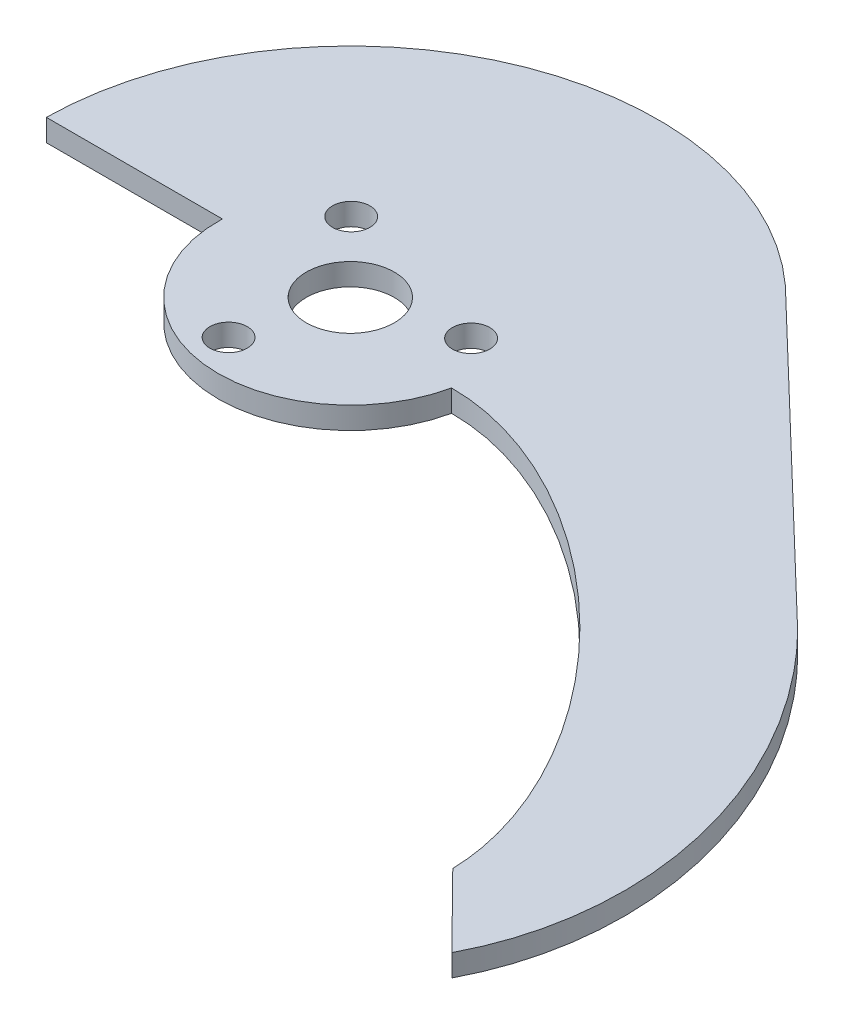
ISO-10303-21;
HEADER;
FILE_DESCRIPTION(('STEP AP214'),'2;1');
FILE_NAME('part.step','',(''),(''),'','','');
FILE_SCHEMA(('AUTOMOTIVE_DESIGN { 1 0 10303 214 1 1 1 1 }'));
ENDSEC;
DATA;
#1=APPLICATION_CONTEXT('core data for automotive mechanical design processes');
#2=APPLICATION_PROTOCOL_DEFINITION('international standard','automotive_design',2000,#1);
#3=PRODUCT_CONTEXT('',#1,'mechanical');
#4=PRODUCT('Part','Part','',(#3));
#5=PRODUCT_RELATED_PRODUCT_CATEGORY('part','',(#4));
#6=PRODUCT_DEFINITION_FORMATION('','',#4);
#7=PRODUCT_DEFINITION_CONTEXT('part definition',#1,'design');
#8=PRODUCT_DEFINITION('design','',#6,#7);
#9=PRODUCT_DEFINITION_SHAPE('','',#8);
#10=(LENGTH_UNIT() NAMED_UNIT(*) SI_UNIT(.MILLI.,.METRE.));
#11=(NAMED_UNIT(*) PLANE_ANGLE_UNIT() SI_UNIT($,.RADIAN.));
#12=(NAMED_UNIT(*) SI_UNIT($,.STERADIAN.) SOLID_ANGLE_UNIT());
#13=UNCERTAINTY_MEASURE_WITH_UNIT(LENGTH_MEASURE(1.E-05),#10,'distance_accuracy_value','');
#14=(GEOMETRIC_REPRESENTATION_CONTEXT(3) GLOBAL_UNCERTAINTY_ASSIGNED_CONTEXT((#13)) GLOBAL_UNIT_ASSIGNED_CONTEXT((#10,
#11,#12)) REPRESENTATION_CONTEXT('',''));
#15=CARTESIAN_POINT('',(0.,0.,0.));
#16=DIRECTION('',(0.,0.,1.));
#17=DIRECTION('',(1.,0.,0.));
#18=AXIS2_PLACEMENT_3D('',#15,#16,#17);
#19=CARTESIAN_POINT('',(25.9929288739405,2.,26.3318751431467));
#20=DIRECTION('',(0.,-1.,0.));
#21=DIRECTION('',(0.,0.,-1.));
#22=AXIS2_PLACEMENT_3D('',#19,#20,#21);
#23=PLANE('',#22);
#24=CARTESIAN_POINT('',(25.9929288739405,2.,26.3318751431467));
#25=DIRECTION('',(0.,1.,0.));
#26=DIRECTION('',(-0.702511591187583,0.,-0.711672301166127));
#27=AXIS2_PLACEMENT_3D('',#24,#25,#26);
#28=ELLIPSE('',#27,37.,29.);
#29=CARTESIAN_POINT('',(56.1989749616137,2.,46.9675578994099));
#30=VERTEX_POINT('',#29);
#31=CARTESIAN_POINT('',(46.6314256077582,2.,5.95903899870688));
#32=VERTEX_POINT('',#31);
#33=EDGE_CURVE('E204',#30,#32,#28,.T.);
#34=ORIENTED_EDGE('',*,*,#33,.T.);
#35=DIRECTION('',(-0.721486768193004,0.,-0.692428222505708));
#36=VECTOR('',#35,1.);
#37=CARTESIAN_POINT('',(46.6314256077582,2.,5.95903899870688));
#38=LINE('',#37,#36);
#39=CARTESIAN_POINT('',(18.8288086844172,2.,-20.723801859833));
#40=VERTEX_POINT('',#39);
#41=EDGE_CURVE('E93',#32,#40,#38,.T.);
#42=ORIENTED_EDGE('',*,*,#41,.T.);
#43=CARTESIAN_POINT('',(0.,2.,0.));
#44=DIRECTION('',(0.,1.,0.));
#45=DIRECTION('',(0.,0.,-1.));
#46=AXIS2_PLACEMENT_3D('',#43,#44,#45);
#47=CIRCLE('',#46,28.);
#48=CARTESIAN_POINT('',(-27.9976502789953,2.,-0.362737997837238));
#49=VERTEX_POINT('',#48);
#50=EDGE_CURVE('E208',#40,#49,#47,.T.);
#51=ORIENTED_EDGE('',*,*,#50,.T.);
#52=DIRECTION('',(1.,0.,0.));
#53=VECTOR('',#52,1.);
#54=CARTESIAN_POINT('',(-11.9945162947459,2.,-0.362737997837457));
#55=LINE('',#54,#53);
#56=CARTESIAN_POINT('',(-11.9945162947496,2.,-0.362737997837571));
#57=VERTEX_POINT('',#56);
#58=EDGE_CURVE('E109',#49,#57,#55,.T.);
#59=ORIENTED_EDGE('',*,*,#58,.T.);
#60=CARTESIAN_POINT('',(0.,2.,0.));
#61=DIRECTION('',(0.,1.,0.));
#62=DIRECTION('',(0.,0.,1.));
#63=AXIS2_PLACEMENT_3D('',#60,#61,#62);
#64=CIRCLE('',#63,12.0000000000037);
#65=CARTESIAN_POINT('',(11.7317613570304,2.,2.52304884254457));
#66=VERTEX_POINT('',#65);
#67=EDGE_CURVE('E103',#57,#66,#64,.T.);
#68=ORIENTED_EDGE('',*,*,#67,.T.);
#69=CARTESIAN_POINT('',(25.9929288739405,2.,26.3318751431467));
#70=DIRECTION('',(0.,-1.,0.));
#71=DIRECTION('',(0.702511591187581,0.,0.711672301166128));
#72=AXIS2_PLACEMENT_3D('',#69,#70,#71);
#73=ELLIPSE('',#72,30.,15.);
#74=CARTESIAN_POINT('',(49.6143738528614,2.,40.2970939780885));
#75=VERTEX_POINT('',#74);
#76=EDGE_CURVE('E107',#66,#75,#73,.T.);
#77=ORIENTED_EDGE('',*,*,#76,.T.);
#78=DIRECTION('',(0.70251159118758,0.,0.711672301166129));
#79=VECTOR('',#78,1.);
#80=CARTESIAN_POINT('',(49.6143738528614,2.,40.2970939780885));
#81=LINE('',#80,#79);
#82=EDGE_CURVE('E53',#75,#30,#81,.T.);
#83=ORIENTED_EDGE('',*,*,#82,.T.);
#84=EDGE_LOOP('',(#34,#42,#51,#59,#68,#77,#83));
#85=FACE_BOUND('',#84,.T.);
#86=CARTESIAN_POINT('',(0.,2.,0.));
#87=DIRECTION('',(0.,1.,0.));
#88=DIRECTION('',(0.,0.,1.));
#89=AXIS2_PLACEMENT_3D('',#86,#87,#88);
#90=CIRCLE('',#89,4.);
#91=CARTESIAN_POINT('',(0.,2.,4.));
#92=VERTEX_POINT('',#91);
#93=EDGE_CURVE('E199',#92,#92,#90,.T.);
#94=ORIENTED_EDGE('',*,*,#93,.F.);
#95=EDGE_LOOP('',(#94));
#96=FACE_BOUND('',#95,.T.);
#97=CARTESIAN_POINT('',(-6.32260432068822,2.,-6.40505071049517));
#98=DIRECTION('',(0.,1.,0.));
#99=DIRECTION('',(0.,0.,1.));
#100=AXIS2_PLACEMENT_3D('',#97,#98,#99);
#101=CIRCLE('',#100,1.7);
#102=CARTESIAN_POINT('',(-6.32260432068822,2.,-4.70505071049517));
#103=VERTEX_POINT('',#102);
#104=EDGE_CURVE('E193',#103,#103,#101,.T.);
#105=ORIENTED_EDGE('',*,*,#104,.F.);
#106=EDGE_LOOP('',(#105));
#107=FACE_BOUND('',#106,.T.);
#108=CARTESIAN_POINT('',(8.70823878816048,2.,-2.27301060454571));
#109=DIRECTION('',(0.,1.,0.));
#110=DIRECTION('',(0.,0.,1.));
#111=AXIS2_PLACEMENT_3D('',#108,#109,#110);
#112=CIRCLE('',#111,1.7);
#113=CARTESIAN_POINT('',(8.70823878816048,2.,-0.573010604545707));
#114=VERTEX_POINT('',#113);
#115=EDGE_CURVE('E187',#114,#114,#112,.T.);
#116=ORIENTED_EDGE('',*,*,#115,.F.);
#117=EDGE_LOOP('',(#116));
#118=FACE_BOUND('',#117,.T.);
#119=CARTESIAN_POINT('',(-2.38563446747228,2.,8.67806131504083));
#120=DIRECTION('',(0.,1.,0.));
#121=DIRECTION('',(0.,0.,1.));
#122=AXIS2_PLACEMENT_3D('',#119,#120,#121);
#123=CIRCLE('',#122,1.7);
#124=CARTESIAN_POINT('',(-2.38563446747228,2.,10.3780613150408));
#125=VERTEX_POINT('',#124);
#126=EDGE_CURVE('E178',#125,#125,#123,.T.);
#127=ORIENTED_EDGE('',*,*,#126,.F.);
#128=EDGE_LOOP('',(#127));
#129=FACE_BOUND('',#128,.T.);
#130=ADVANCED_FACE('F35',(#85,#96,#107,#118,#129),#23,.F.);
#131=CARTESIAN_POINT('',(25.9929288739405,0.,26.3318751431467));
#132=DIRECTION('',(0.,-1.,0.));
#133=DIRECTION('',(0.,0.,-1.));
#134=AXIS2_PLACEMENT_3D('',#131,#132,#133);
#135=PLANE('',#134);
#136=CARTESIAN_POINT('',(8.70823878816048,0.,-2.27301060454571));
#137=DIRECTION('',(0.,1.,0.));
#138=DIRECTION('',(0.,0.,1.));
#139=AXIS2_PLACEMENT_3D('',#136,#137,#138);
#140=CIRCLE('',#139,1.7);
#141=CARTESIAN_POINT('',(8.70823878816048,0.,-0.573010604545707));
#142=VERTEX_POINT('',#141);
#143=EDGE_CURVE('E184',#142,#142,#140,.T.);
#144=ORIENTED_EDGE('',*,*,#143,.T.);
#145=EDGE_LOOP('',(#144));
#146=FACE_BOUND('',#145,.T.);
#147=CARTESIAN_POINT('',(0.,0.,0.));
#148=DIRECTION('',(0.,1.,0.));
#149=DIRECTION('',(0.,0.,1.));
#150=AXIS2_PLACEMENT_3D('',#147,#148,#149);
#151=CIRCLE('',#150,4.);
#152=CARTESIAN_POINT('',(0.,0.,4.));
#153=VERTEX_POINT('',#152);
#154=EDGE_CURVE('E196',#153,#153,#151,.T.);
#155=ORIENTED_EDGE('',*,*,#154,.T.);
#156=EDGE_LOOP('',(#155));
#157=FACE_BOUND('',#156,.T.);
#158=CARTESIAN_POINT('',(25.9929288739405,0.,26.3318751431467));
#159=DIRECTION('',(0.,1.,0.));
#160=DIRECTION('',(-0.702511591187583,0.,-0.711672301166127));
#161=AXIS2_PLACEMENT_3D('',#158,#159,#160);
#162=ELLIPSE('',#161,37.,29.);
#163=CARTESIAN_POINT('',(56.1989749616137,0.,46.9675578994099));
#164=VERTEX_POINT('',#163);
#165=CARTESIAN_POINT('',(46.6314256077582,0.,5.95903899870688));
#166=VERTEX_POINT('',#165);
#167=EDGE_CURVE('E202',#164,#166,#162,.T.);
#168=ORIENTED_EDGE('',*,*,#167,.F.);
#169=DIRECTION('',(0.70251159118758,0.,0.711672301166129));
#170=VECTOR('',#169,1.);
#171=CARTESIAN_POINT('',(49.6143738528614,0.,40.2970939780885));
#172=LINE('',#171,#170);
#173=CARTESIAN_POINT('',(49.6143738528614,0.,40.2970939780885));
#174=VERTEX_POINT('',#173);
#175=EDGE_CURVE('E85',#174,#164,#172,.T.);
#176=ORIENTED_EDGE('',*,*,#175,.F.);
#177=CARTESIAN_POINT('',(25.9929288739405,0.,26.3318751431467));
#178=DIRECTION('',(0.,-1.,0.));
#179=DIRECTION('',(0.702511591187581,0.,0.711672301166128));
#180=AXIS2_PLACEMENT_3D('',#177,#178,#179);
#181=ELLIPSE('',#180,30.,15.);
#182=CARTESIAN_POINT('',(11.7317613570304,0.,2.52304884254457));
#183=VERTEX_POINT('',#182);
#184=EDGE_CURVE('E79',#183,#174,#181,.T.);
#185=ORIENTED_EDGE('',*,*,#184,.F.);
#186=CARTESIAN_POINT('',(0.,0.,0.));
#187=DIRECTION('',(0.,1.,0.));
#188=DIRECTION('',(0.,0.,1.));
#189=AXIS2_PLACEMENT_3D('',#186,#187,#188);
#190=CIRCLE('',#189,12.0000000000037);
#191=CARTESIAN_POINT('',(-11.9945162947496,0.,-0.362737997837571));
#192=VERTEX_POINT('',#191);
#193=EDGE_CURVE('E117',#192,#183,#190,.T.);
#194=ORIENTED_EDGE('',*,*,#193,.F.);
#195=DIRECTION('',(1.,0.,0.));
#196=VECTOR('',#195,1.);
#197=CARTESIAN_POINT('',(-11.9945162947459,0.,-0.362737997837457));
#198=LINE('',#197,#196);
#199=CARTESIAN_POINT('',(-27.9976502789953,0.,-0.362737997837238));
#200=VERTEX_POINT('',#199);
#201=EDGE_CURVE('E217',#200,#192,#198,.T.);
#202=ORIENTED_EDGE('',*,*,#201,.F.);
#203=CARTESIAN_POINT('',(0.,0.,0.));
#204=DIRECTION('',(0.,1.,0.));
#205=DIRECTION('',(0.,0.,1.));
#206=AXIS2_PLACEMENT_3D('',#203,#204,#205);
#207=CIRCLE('',#206,28.);
#208=CARTESIAN_POINT('',(18.8288086844172,0.,-20.723801859833));
#209=VERTEX_POINT('',#208);
#210=EDGE_CURVE('E214',#209,#200,#207,.T.);
#211=ORIENTED_EDGE('',*,*,#210,.F.);
#212=DIRECTION('',(-0.721486768193004,0.,-0.692428222505708));
#213=VECTOR('',#212,1.);
#214=CARTESIAN_POINT('',(46.6314256077582,0.,5.95903899870688));
#215=LINE('',#214,#213);
#216=EDGE_CURVE('E220',#166,#209,#215,.T.);
#217=ORIENTED_EDGE('',*,*,#216,.F.);
#218=EDGE_LOOP('',(#168,#176,#185,#194,#202,#211,#217));
#219=FACE_BOUND('',#218,.T.);
#220=CARTESIAN_POINT('',(-6.32260432068822,0.,-6.40505071049517));
#221=DIRECTION('',(0.,1.,0.));
#222=DIRECTION('',(0.,0.,1.));
#223=AXIS2_PLACEMENT_3D('',#220,#221,#222);
#224=CIRCLE('',#223,1.7);
#225=CARTESIAN_POINT('',(-6.32260432068822,0.,-4.70505071049517));
#226=VERTEX_POINT('',#225);
#227=EDGE_CURVE('E190',#226,#226,#224,.T.);
#228=ORIENTED_EDGE('',*,*,#227,.T.);
#229=EDGE_LOOP('',(#228));
#230=FACE_BOUND('',#229,.T.);
#231=CARTESIAN_POINT('',(-2.38563446747228,0.,8.67806131504083));
#232=DIRECTION('',(0.,1.,0.));
#233=DIRECTION('',(0.,0.,1.));
#234=AXIS2_PLACEMENT_3D('',#231,#232,#233);
#235=CIRCLE('',#234,1.7);
#236=CARTESIAN_POINT('',(-2.38563446747228,0.,10.3780613150408));
#237=VERTEX_POINT('',#236);
#238=EDGE_CURVE('E181',#237,#237,#235,.T.);
#239=ORIENTED_EDGE('',*,*,#238,.T.);
#240=EDGE_LOOP('',(#239));
#241=FACE_BOUND('',#240,.T.);
#242=ADVANCED_FACE('F148',(#146,#157,#219,#230,#241),#135,.T.);
#243=DIRECTION('',(0.,-1.,0.));
#244=VECTOR('',#243,1.);
#245=SURFACE_OF_LINEAR_EXTRUSION('',#28,#244);
#246=ORIENTED_EDGE('',*,*,#167,.T.);
#247=DIRECTION('',(0.,-1.,0.));
#248=VECTOR('',#247,1.);
#249=CARTESIAN_POINT('',(46.6314256077582,2.,5.95903899870688));
#250=LINE('',#249,#248);
#251=EDGE_CURVE('E11',#32,#166,#250,.T.);
#252=ORIENTED_EDGE('',*,*,#251,.F.);
#253=ORIENTED_EDGE('',*,*,#33,.F.);
#254=DIRECTION('',(0.,-1.,0.));
#255=VECTOR('',#254,1.);
#256=CARTESIAN_POINT('',(56.1989749616137,2.,46.9675578994099));
#257=LINE('',#256,#255);
#258=EDGE_CURVE('E123',#30,#164,#257,.T.);
#259=ORIENTED_EDGE('',*,*,#258,.T.);
#260=EDGE_LOOP('',(#246,#252,#253,#259));
#261=FACE_BOUND('',#260,.T.);
#262=ADVANCED_FACE('F37',(#261),#245,.F.);
#263=CARTESIAN_POINT('',(46.6314256077582,2.,5.95903899870688));
#264=DIRECTION('',(-0.692428222505708,0.,0.721486768193004));
#265=DIRECTION('',(0.721486768193004,0.,0.692428222505708));
#266=AXIS2_PLACEMENT_3D('',#263,#264,#265);
#267=PLANE('',#266);
#268=ORIENTED_EDGE('',*,*,#216,.T.);
#269=DIRECTION('',(0.,-1.,0.));
#270=VECTOR('',#269,1.);
#271=CARTESIAN_POINT('',(18.8288086844172,2.,-20.723801859833));
#272=LINE('',#271,#270);
#273=EDGE_CURVE('E45',#40,#209,#272,.T.);
#274=ORIENTED_EDGE('',*,*,#273,.F.);
#275=ORIENTED_EDGE('',*,*,#41,.F.);
#276=ORIENTED_EDGE('',*,*,#251,.T.);
#277=EDGE_LOOP('',(#268,#274,#275,#276));
#278=FACE_BOUND('',#277,.T.);
#279=ADVANCED_FACE('F142',(#278),#267,.F.);
#280=CARTESIAN_POINT('',(0.,2.,0.));
#281=DIRECTION('',(0.,-1.,0.));
#282=DIRECTION('',(0.,0.,-1.));
#283=AXIS2_PLACEMENT_3D('',#280,#281,#282);
#284=CYLINDRICAL_SURFACE('',#283,28.);
#285=ORIENTED_EDGE('',*,*,#210,.T.);
#286=DIRECTION('',(0.,-1.,0.));
#287=VECTOR('',#286,1.);
#288=CARTESIAN_POINT('',(-27.9976502789953,2.,-0.362737997837238));
#289=LINE('',#288,#287);
#290=EDGE_CURVE('E213',#49,#200,#289,.T.);
#291=ORIENTED_EDGE('',*,*,#290,.F.);
#292=ORIENTED_EDGE('',*,*,#50,.F.);
#293=ORIENTED_EDGE('',*,*,#273,.T.);
#294=EDGE_LOOP('',(#285,#291,#292,#293));
#295=FACE_BOUND('',#294,.T.);
#296=ADVANCED_FACE('F139',(#295),#284,.T.);
#297=CARTESIAN_POINT('',(-11.9945162947459,2.,-0.362737997837457));
#298=DIRECTION('',(0.,0.,-1.));
#299=DIRECTION('',(-1.,0.,0.));
#300=AXIS2_PLACEMENT_3D('',#297,#298,#299);
#301=PLANE('',#300);
#302=ORIENTED_EDGE('',*,*,#201,.T.);
#303=DIRECTION('',(0.,-1.,0.));
#304=VECTOR('',#303,1.);
#305=CARTESIAN_POINT('',(-11.9945162947496,2.,-0.362737997837571));
#306=LINE('',#305,#304);
#307=EDGE_CURVE('E118',#57,#192,#306,.T.);
#308=ORIENTED_EDGE('',*,*,#307,.F.);
#309=ORIENTED_EDGE('',*,*,#58,.F.);
#310=ORIENTED_EDGE('',*,*,#290,.T.);
#311=EDGE_LOOP('',(#302,#308,#309,#310));
#312=FACE_BOUND('',#311,.T.);
#313=ADVANCED_FACE('F136',(#312),#301,.F.);
#314=CARTESIAN_POINT('',(0.,2.,0.));
#315=DIRECTION('',(0.,-1.,0.));
#316=DIRECTION('',(0.,0.,-1.));
#317=AXIS2_PLACEMENT_3D('',#314,#315,#316);
#318=CYLINDRICAL_SURFACE('',#317,12.0000000000037);
#319=ORIENTED_EDGE('',*,*,#193,.T.);
#320=DIRECTION('',(0.,-1.,0.));
#321=VECTOR('',#320,1.);
#322=CARTESIAN_POINT('',(11.7317613570304,2.,2.52304884254457));
#323=LINE('',#322,#321);
#324=EDGE_CURVE('E114',#66,#183,#323,.T.);
#325=ORIENTED_EDGE('',*,*,#324,.F.);
#326=ORIENTED_EDGE('',*,*,#67,.F.);
#327=ORIENTED_EDGE('',*,*,#307,.T.);
#328=EDGE_LOOP('',(#319,#325,#326,#327));
#329=FACE_BOUND('',#328,.T.);
#330=ADVANCED_FACE('F115',(#329),#318,.T.);
#331=DIRECTION('',(0.,-1.,0.));
#332=VECTOR('',#331,1.);
#333=SURFACE_OF_LINEAR_EXTRUSION('',#73,#332);
#334=ORIENTED_EDGE('',*,*,#184,.T.);
#335=DIRECTION('',(0.,-1.,0.));
#336=VECTOR('',#335,1.);
#337=CARTESIAN_POINT('',(49.6143738528614,2.,40.2970939780885));
#338=LINE('',#337,#336);
#339=EDGE_CURVE('E119',#75,#174,#338,.T.);
#340=ORIENTED_EDGE('',*,*,#339,.F.);
#341=ORIENTED_EDGE('',*,*,#76,.F.);
#342=ORIENTED_EDGE('',*,*,#324,.T.);
#343=EDGE_LOOP('',(#334,#340,#341,#342));
#344=FACE_BOUND('',#343,.T.);
#345=ADVANCED_FACE('F121',(#344),#333,.F.);
#346=CARTESIAN_POINT('',(49.6143738528614,2.,40.2970939780885));
#347=DIRECTION('',(0.711672301166129,0.,-0.702511591187581));
#348=DIRECTION('',(-0.702511591187581,0.,-0.711672301166129));
#349=AXIS2_PLACEMENT_3D('',#346,#347,#348);
#350=PLANE('',#349);
#351=ORIENTED_EDGE('',*,*,#175,.T.);
#352=ORIENTED_EDGE('',*,*,#258,.F.);
#353=ORIENTED_EDGE('',*,*,#82,.F.);
#354=ORIENTED_EDGE('',*,*,#339,.T.);
#355=EDGE_LOOP('',(#351,#352,#353,#354));
#356=FACE_BOUND('',#355,.T.);
#357=ADVANCED_FACE('F132',(#356),#350,.F.);
#358=CARTESIAN_POINT('',(0.,2.,0.));
#359=DIRECTION('',(0.,-1.,0.));
#360=DIRECTION('',(0.,0.,-1.));
#361=AXIS2_PLACEMENT_3D('',#358,#359,#360);
#362=CYLINDRICAL_SURFACE('',#361,4.);
#363=ORIENTED_EDGE('',*,*,#93,.T.);
#364=EDGE_LOOP('',(#363));
#365=FACE_BOUND('',#364,.T.);
#366=ORIENTED_EDGE('',*,*,#154,.F.);
#367=EDGE_LOOP('',(#366));
#368=FACE_BOUND('',#367,.T.);
#369=ADVANCED_FACE('F158',(#365,#368),#362,.F.);
#370=CARTESIAN_POINT('',(-6.32260432068822,2.,-6.40505071049517));
#371=DIRECTION('',(0.,-1.,0.));
#372=DIRECTION('',(0.,0.,-1.));
#373=AXIS2_PLACEMENT_3D('',#370,#371,#372);
#374=CYLINDRICAL_SURFACE('',#373,1.7);
#375=ORIENTED_EDGE('',*,*,#104,.T.);
#376=EDGE_LOOP('',(#375));
#377=FACE_BOUND('',#376,.T.);
#378=ORIENTED_EDGE('',*,*,#227,.F.);
#379=EDGE_LOOP('',(#378));
#380=FACE_BOUND('',#379,.T.);
#381=ADVANCED_FACE('F161',(#377,#380),#374,.F.);
#382=CARTESIAN_POINT('',(8.70823878816048,2.,-2.27301060454571));
#383=DIRECTION('',(0.,-1.,0.));
#384=DIRECTION('',(0.,0.,-1.));
#385=AXIS2_PLACEMENT_3D('',#382,#383,#384);
#386=CYLINDRICAL_SURFACE('',#385,1.7);
#387=ORIENTED_EDGE('',*,*,#115,.T.);
#388=EDGE_LOOP('',(#387));
#389=FACE_BOUND('',#388,.T.);
#390=ORIENTED_EDGE('',*,*,#143,.F.);
#391=EDGE_LOOP('',(#390));
#392=FACE_BOUND('',#391,.T.);
#393=ADVANCED_FACE('F165',(#389,#392),#386,.F.);
#394=CARTESIAN_POINT('',(-2.38563446747228,2.,8.67806131504083));
#395=DIRECTION('',(0.,-1.,0.));
#396=DIRECTION('',(0.,0.,-1.));
#397=AXIS2_PLACEMENT_3D('',#394,#395,#396);
#398=CYLINDRICAL_SURFACE('',#397,1.7);
#399=ORIENTED_EDGE('',*,*,#126,.T.);
#400=EDGE_LOOP('',(#399));
#401=FACE_BOUND('',#400,.T.);
#402=ORIENTED_EDGE('',*,*,#238,.F.);
#403=EDGE_LOOP('',(#402));
#404=FACE_BOUND('',#403,.T.);
#405=ADVANCED_FACE('F169',(#401,#404),#398,.F.);
#406=CLOSED_SHELL('',(#130,#242,#262,#279,#296,#313,#330,#345,#357,#369,#381,#393,#405));
#407=MANIFOLD_SOLID_BREP('B2',#406);
#408=ADVANCED_BREP_SHAPE_REPRESENTATION('',(#18,#407),#14);
#409=SHAPE_DEFINITION_REPRESENTATION(#9,#408);
ENDSEC;
END-ISO-10303-21;
